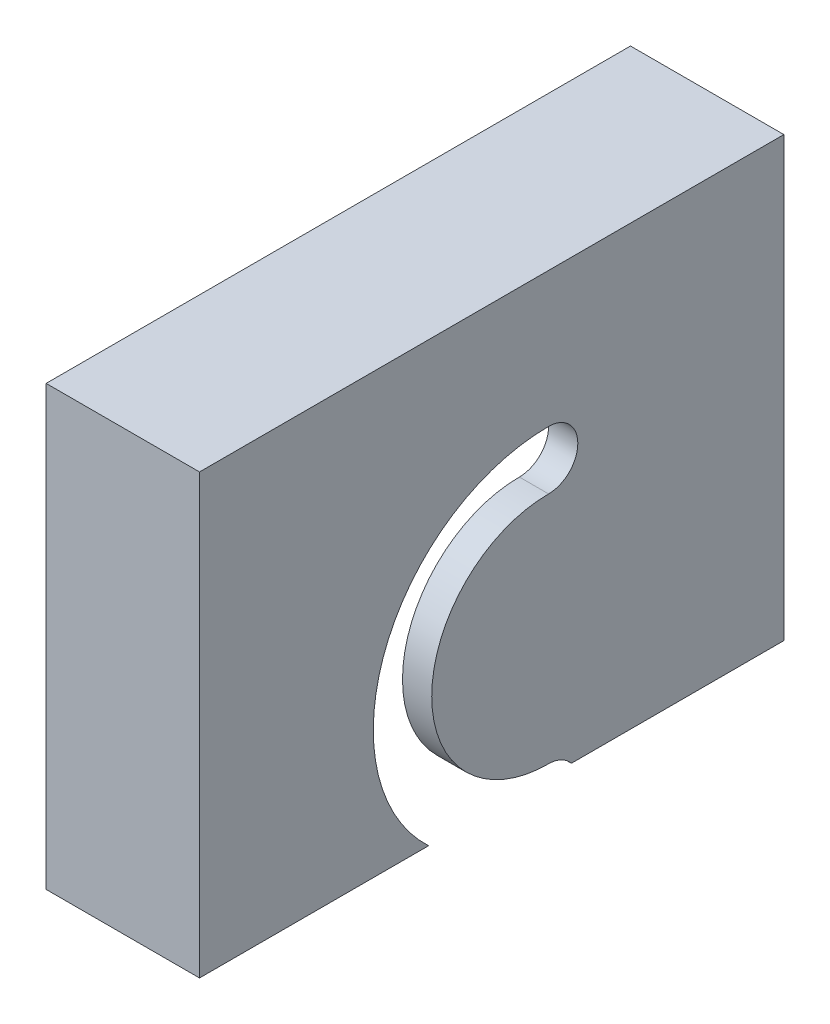
ISO-10303-21;
HEADER;
FILE_DESCRIPTION(('STEP AP214'),'2;1');
FILE_NAME('part.step','',(''),(''),'','','');
FILE_SCHEMA(('AUTOMOTIVE_DESIGN { 1 0 10303 214 1 1 1 1 }'));
ENDSEC;
DATA;
#1=APPLICATION_CONTEXT('core data for automotive mechanical design processes');
#2=APPLICATION_PROTOCOL_DEFINITION('international standard','automotive_design',2000,#1);
#3=PRODUCT_CONTEXT('',#1,'mechanical');
#4=PRODUCT('Part','Part','',(#3));
#5=PRODUCT_RELATED_PRODUCT_CATEGORY('part','',(#4));
#6=PRODUCT_DEFINITION_FORMATION('','',#4);
#7=PRODUCT_DEFINITION_CONTEXT('part definition',#1,'design');
#8=PRODUCT_DEFINITION('design','',#6,#7);
#9=PRODUCT_DEFINITION_SHAPE('','',#8);
#10=(LENGTH_UNIT() NAMED_UNIT(*) SI_UNIT(.MILLI.,.METRE.));
#11=(NAMED_UNIT(*) PLANE_ANGLE_UNIT() SI_UNIT($,.RADIAN.));
#12=(NAMED_UNIT(*) SI_UNIT($,.STERADIAN.) SOLID_ANGLE_UNIT());
#13=UNCERTAINTY_MEASURE_WITH_UNIT(LENGTH_MEASURE(1.E-05),#10,'distance_accuracy_value','');
#14=(GEOMETRIC_REPRESENTATION_CONTEXT(3) GLOBAL_UNCERTAINTY_ASSIGNED_CONTEXT((#13)) GLOBAL_UNIT_ASSIGNED_CONTEXT((#10,
#11,#12)) REPRESENTATION_CONTEXT('',''));
#15=CARTESIAN_POINT('',(0.,0.,0.));
#16=DIRECTION('',(0.,0.,1.));
#17=DIRECTION('',(1.,0.,0.));
#18=AXIS2_PLACEMENT_3D('',#15,#16,#17);
#19=CARTESIAN_POINT('',(21.,-30.,40.));
#20=DIRECTION('',(0.,1.,0.));
#21=DIRECTION('',(0.,0.,1.));
#22=AXIS2_PLACEMENT_3D('',#19,#20,#21);
#23=PLANE('',#22);
#24=DIRECTION('',(1.,0.,0.));
#25=VECTOR('',#24,1.);
#26=CARTESIAN_POINT('',(-55.5697759577992,-30.,-10.9124989991992));
#27=LINE('',#26,#25);
#28=CARTESIAN_POINT('',(21.,-30.,-10.9124989991992));
#29=VERTEX_POINT('',#28);
#30=CARTESIAN_POINT('',(17.,-30.,-10.9124989991992));
#31=VERTEX_POINT('',#30);
#32=EDGE_CURVE('E194',#29,#31,#27,.F.);
#33=ORIENTED_EDGE('',*,*,#32,.T.);
#34=DIRECTION('',(0.,0.,1.));
#35=VECTOR('',#34,1.);
#36=CARTESIAN_POINT('',(17.,-30.,-35.));
#37=LINE('',#36,#35);
#38=CARTESIAN_POINT('',(17.,-30.,-35.));
#39=VERTEX_POINT('',#38);
#40=EDGE_CURVE('E147',#39,#31,#37,.T.);
#41=ORIENTED_EDGE('',*,*,#40,.F.);
#42=DIRECTION('',(-1.,0.,0.));
#43=VECTOR('',#42,1.);
#44=CARTESIAN_POINT('',(110.022469073824,-30.,-35.));
#45=LINE('',#44,#43);
#46=CARTESIAN_POINT('',(0.,-30.,-35.));
#47=VERTEX_POINT('',#46);
#48=EDGE_CURVE('E165',#39,#47,#45,.T.);
#49=ORIENTED_EDGE('',*,*,#48,.T.);
#50=DIRECTION('',(0.,0.,-1.));
#51=VECTOR('',#50,1.);
#52=CARTESIAN_POINT('',(0.,-30.,40.));
#53=LINE('',#52,#51);
#54=CARTESIAN_POINT('',(0.,-30.,-40.));
#55=VERTEX_POINT('',#54);
#56=EDGE_CURVE('E208',#47,#55,#53,.T.);
#57=ORIENTED_EDGE('',*,*,#56,.T.);
#58=DIRECTION('',(-1.,0.,0.));
#59=VECTOR('',#58,1.);
#60=CARTESIAN_POINT('',(21.,-30.,-40.));
#61=LINE('',#60,#59);
#62=CARTESIAN_POINT('',(21.,-30.,-40.));
#63=VERTEX_POINT('',#62);
#64=EDGE_CURVE('E216',#63,#55,#61,.T.);
#65=ORIENTED_EDGE('',*,*,#64,.F.);
#66=DIRECTION('',(0.,0.,-1.));
#67=VECTOR('',#66,1.);
#68=CARTESIAN_POINT('',(21.,-30.,40.));
#69=LINE('',#68,#67);
#70=EDGE_CURVE('E200',#29,#63,#69,.T.);
#71=ORIENTED_EDGE('',*,*,#70,.F.);
#72=EDGE_LOOP('',(#33,#41,#49,#57,#65,#71));
#73=FACE_BOUND('',#72,.T.);
#74=ADVANCED_FACE('F35',(#73),#23,.F.);
#75=CARTESIAN_POINT('',(21.,0.,0.));
#76=DIRECTION('',(1.,0.,0.));
#77=DIRECTION('',(0.,0.,-1.));
#78=AXIS2_PLACEMENT_3D('',#75,#76,#77);
#79=PLANE('',#78);
#80=CARTESIAN_POINT('',(21.,-32.5,-7.79000000000001));
#81=DIRECTION('',(1.,0.,0.));
#82=DIRECTION('',(0.,0.,-1.));
#83=AXIS2_PLACEMENT_3D('',#80,#81,#82);
#84=CIRCLE('',#83,4.);
#85=CARTESIAN_POINT('',(21.,-28.5,-7.79));
#86=VERTEX_POINT('',#85);
#87=EDGE_CURVE('E174',#29,#86,#84,.T.);
#88=ORIENTED_EDGE('',*,*,#87,.F.);
#89=ORIENTED_EDGE('',*,*,#70,.T.);
#90=DIRECTION('',(0.,1.,0.));
#91=VECTOR('',#90,1.);
#92=CARTESIAN_POINT('',(21.,30.,-40.));
#93=LINE('',#92,#91);
#94=CARTESIAN_POINT('',(21.,30.,-40.));
#95=VERTEX_POINT('',#94);
#96=EDGE_CURVE('E202',#63,#95,#93,.T.);
#97=ORIENTED_EDGE('',*,*,#96,.T.);
#98=DIRECTION('',(0.,0.,1.));
#99=VECTOR('',#98,1.);
#100=CARTESIAN_POINT('',(21.,30.,40.));
#101=LINE('',#100,#99);
#102=CARTESIAN_POINT('',(21.,30.,40.));
#103=VERTEX_POINT('',#102);
#104=EDGE_CURVE('E58',#95,#103,#101,.T.);
#105=ORIENTED_EDGE('',*,*,#104,.T.);
#106=DIRECTION('',(0.,-1.,0.));
#107=VECTOR('',#106,1.);
#108=CARTESIAN_POINT('',(21.,30.,40.));
#109=LINE('',#108,#107);
#110=CARTESIAN_POINT('',(21.,-30.,40.));
#111=VERTEX_POINT('',#110);
#112=EDGE_CURVE('E198',#103,#111,#109,.T.);
#113=ORIENTED_EDGE('',*,*,#112,.T.);
#114=CARTESIAN_POINT('',(21.,-30.,8.63406770565684));
#115=VERTEX_POINT('',#114);
#116=EDGE_CURVE('E87',#111,#115,#69,.T.);
#117=ORIENTED_EDGE('',*,*,#116,.T.);
#118=CARTESIAN_POINT('',(21.,-12.5,-7.79000000000001));
#119=DIRECTION('',(1.,0.,0.));
#120=DIRECTION('',(0.,0.,-1.));
#121=AXIS2_PLACEMENT_3D('',#118,#119,#120);
#122=CIRCLE('',#121,24.);
#123=CARTESIAN_POINT('',(21.,11.5,-7.79000000000001));
#124=VERTEX_POINT('',#123);
#125=EDGE_CURVE('E183',#124,#115,#122,.T.);
#126=ORIENTED_EDGE('',*,*,#125,.F.);
#127=CARTESIAN_POINT('',(21.,7.5,-7.79000000000001));
#128=DIRECTION('',(1.,0.,0.));
#129=DIRECTION('',(0.,0.,-1.));
#130=AXIS2_PLACEMENT_3D('',#127,#128,#129);
#131=CIRCLE('',#130,4.);
#132=CARTESIAN_POINT('',(21.,3.5,-7.79000000000001));
#133=VERTEX_POINT('',#132);
#134=EDGE_CURVE('E180',#133,#124,#131,.T.);
#135=ORIENTED_EDGE('',*,*,#134,.F.);
#136=CARTESIAN_POINT('',(21.,-12.5,-7.79000000000001));
#137=DIRECTION('',(-1.,0.,0.));
#138=DIRECTION('',(0.,0.,-1.));
#139=AXIS2_PLACEMENT_3D('',#136,#137,#138);
#140=CIRCLE('',#139,16.);
#141=EDGE_CURVE('E177',#86,#133,#140,.T.);
#142=ORIENTED_EDGE('',*,*,#141,.F.);
#143=EDGE_LOOP('',(#88,#89,#97,#105,#113,#117,#126,#135,#142));
#144=FACE_BOUND('',#143,.T.);
#145=ADVANCED_FACE('F253',(#144),#79,.T.);
#146=CARTESIAN_POINT('',(0.,0.,0.));
#147=DIRECTION('',(1.,0.,0.));
#148=DIRECTION('',(0.,0.,-1.));
#149=AXIS2_PLACEMENT_3D('',#146,#147,#148);
#150=PLANE('',#149);
#151=DIRECTION('',(0.,0.,-1.));
#152=VECTOR('',#151,1.);
#153=CARTESIAN_POINT('',(0.,25.,-35.));
#154=LINE('',#153,#152);
#155=CARTESIAN_POINT('',(0.,25.,35.));
#156=VERTEX_POINT('',#155);
#157=CARTESIAN_POINT('',(0.,25.,-35.));
#158=VERTEX_POINT('',#157);
#159=EDGE_CURVE('E148',#156,#158,#154,.T.);
#160=ORIENTED_EDGE('',*,*,#159,.F.);
#161=DIRECTION('',(0.,1.,0.));
#162=VECTOR('',#161,1.);
#163=CARTESIAN_POINT('',(0.,-30.,35.));
#164=LINE('',#163,#162);
#165=CARTESIAN_POINT('',(0.,-30.,35.));
#166=VERTEX_POINT('',#165);
#167=EDGE_CURVE('E226',#166,#156,#164,.T.);
#168=ORIENTED_EDGE('',*,*,#167,.F.);
#169=CARTESIAN_POINT('',(0.,-30.,40.));
#170=VERTEX_POINT('',#169);
#171=EDGE_CURVE('E160',#170,#166,#53,.T.);
#172=ORIENTED_EDGE('',*,*,#171,.F.);
#173=DIRECTION('',(0.,-1.,0.));
#174=VECTOR('',#173,1.);
#175=CARTESIAN_POINT('',(0.,30.,40.));
#176=LINE('',#175,#174);
#177=CARTESIAN_POINT('',(0.,30.,40.));
#178=VERTEX_POINT('',#177);
#179=EDGE_CURVE('E197',#178,#170,#176,.T.);
#180=ORIENTED_EDGE('',*,*,#179,.F.);
#181=DIRECTION('',(0.,0.,1.));
#182=VECTOR('',#181,1.);
#183=CARTESIAN_POINT('',(0.,30.,40.));
#184=LINE('',#183,#182);
#185=CARTESIAN_POINT('',(0.,30.,-40.));
#186=VERTEX_POINT('',#185);
#187=EDGE_CURVE('E79',#186,#178,#184,.T.);
#188=ORIENTED_EDGE('',*,*,#187,.F.);
#189=DIRECTION('',(0.,1.,0.));
#190=VECTOR('',#189,1.);
#191=CARTESIAN_POINT('',(0.,30.,-40.));
#192=LINE('',#191,#190);
#193=EDGE_CURVE('E210',#55,#186,#192,.T.);
#194=ORIENTED_EDGE('',*,*,#193,.F.);
#195=ORIENTED_EDGE('',*,*,#56,.F.);
#196=DIRECTION('',(0.,-1.,0.));
#197=VECTOR('',#196,1.);
#198=CARTESIAN_POINT('',(0.,-30.,-35.));
#199=LINE('',#198,#197);
#200=EDGE_CURVE('E229',#158,#47,#199,.T.);
#201=ORIENTED_EDGE('',*,*,#200,.F.);
#202=EDGE_LOOP('',(#160,#168,#172,#180,#188,#194,#195,#201));
#203=FACE_BOUND('',#202,.T.);
#204=ADVANCED_FACE('F224',(#203),#150,.F.);
#205=CARTESIAN_POINT('',(21.,30.,40.));
#206=DIRECTION('',(0.,0.,-1.));
#207=DIRECTION('',(-1.,0.,0.));
#208=AXIS2_PLACEMENT_3D('',#205,#206,#207);
#209=PLANE('',#208);
#210=ORIENTED_EDGE('',*,*,#179,.T.);
#211=DIRECTION('',(-1.,0.,0.));
#212=VECTOR('',#211,1.);
#213=CARTESIAN_POINT('',(21.,-30.,40.));
#214=LINE('',#213,#212);
#215=EDGE_CURVE('E43',#111,#170,#214,.T.);
#216=ORIENTED_EDGE('',*,*,#215,.F.);
#217=ORIENTED_EDGE('',*,*,#112,.F.);
#218=DIRECTION('',(-1.,0.,0.));
#219=VECTOR('',#218,1.);
#220=CARTESIAN_POINT('',(21.,30.,40.));
#221=LINE('',#220,#219);
#222=EDGE_CURVE('E205',#103,#178,#221,.T.);
#223=ORIENTED_EDGE('',*,*,#222,.T.);
#224=EDGE_LOOP('',(#210,#216,#217,#223));
#225=FACE_BOUND('',#224,.T.);
#226=ADVANCED_FACE('F37',(#225),#209,.F.);
#227=DIRECTION('',(-1.,0.,0.));
#228=VECTOR('',#227,1.);
#229=CARTESIAN_POINT('',(110.022469073824,-30.,35.));
#230=LINE('',#229,#228);
#231=CARTESIAN_POINT('',(17.,-30.,35.));
#232=VERTEX_POINT('',#231);
#233=EDGE_CURVE('E154',#232,#166,#230,.T.);
#234=ORIENTED_EDGE('',*,*,#233,.F.);
#235=CARTESIAN_POINT('',(17.,-30.,8.63406770565684));
#236=VERTEX_POINT('',#235);
#237=EDGE_CURVE('E138',#236,#232,#37,.T.);
#238=ORIENTED_EDGE('',*,*,#237,.F.);
#239=DIRECTION('',(1.,0.,0.));
#240=VECTOR('',#239,1.);
#241=CARTESIAN_POINT('',(-55.5697759577992,-30.,8.63406770565684));
#242=LINE('',#241,#240);
#243=EDGE_CURVE('E189',#236,#115,#242,.T.);
#244=ORIENTED_EDGE('',*,*,#243,.T.);
#245=ORIENTED_EDGE('',*,*,#116,.F.);
#246=ORIENTED_EDGE('',*,*,#215,.T.);
#247=ORIENTED_EDGE('',*,*,#171,.T.);
#248=EDGE_LOOP('',(#234,#238,#244,#245,#246,#247));
#249=FACE_BOUND('',#248,.T.);
#250=ADVANCED_FACE('F159',(#249),#23,.F.);
#251=CARTESIAN_POINT('',(21.,30.,-40.));
#252=DIRECTION('',(0.,0.,1.));
#253=DIRECTION('',(0.,-1.,0.));
#254=AXIS2_PLACEMENT_3D('',#251,#252,#253);
#255=PLANE('',#254);
#256=ORIENTED_EDGE('',*,*,#193,.T.);
#257=DIRECTION('',(-1.,0.,0.));
#258=VECTOR('',#257,1.);
#259=CARTESIAN_POINT('',(21.,30.,-40.));
#260=LINE('',#259,#258);
#261=EDGE_CURVE('E214',#95,#186,#260,.T.);
#262=ORIENTED_EDGE('',*,*,#261,.F.);
#263=ORIENTED_EDGE('',*,*,#96,.F.);
#264=ORIENTED_EDGE('',*,*,#64,.T.);
#265=EDGE_LOOP('',(#256,#262,#263,#264));
#266=FACE_BOUND('',#265,.T.);
#267=ADVANCED_FACE('F250',(#266),#255,.F.);
#268=CARTESIAN_POINT('',(21.,30.,40.));
#269=DIRECTION('',(0.,-1.,0.));
#270=DIRECTION('',(0.,0.,-1.));
#271=AXIS2_PLACEMENT_3D('',#268,#269,#270);
#272=PLANE('',#271);
#273=ORIENTED_EDGE('',*,*,#187,.T.);
#274=ORIENTED_EDGE('',*,*,#222,.F.);
#275=ORIENTED_EDGE('',*,*,#104,.F.);
#276=ORIENTED_EDGE('',*,*,#261,.T.);
#277=EDGE_LOOP('',(#273,#274,#275,#276));
#278=FACE_BOUND('',#277,.T.);
#279=ADVANCED_FACE('F275',(#278),#272,.F.);
#280=CARTESIAN_POINT('',(-55.5697759577992,-32.5,-7.79000000000001));
#281=DIRECTION('',(1.,0.,0.));
#282=DIRECTION('',(0.,0.,-1.));
#283=AXIS2_PLACEMENT_3D('',#280,#281,#282);
#284=CYLINDRICAL_SURFACE('',#283,4.);
#285=DIRECTION('',(1.,0.,0.));
#286=VECTOR('',#285,1.);
#287=CARTESIAN_POINT('',(-55.5697759577992,-28.5,-7.79));
#288=LINE('',#287,#286);
#289=CARTESIAN_POINT('',(17.,-28.5,-7.79));
#290=VERTEX_POINT('',#289);
#291=EDGE_CURVE('E186',#290,#86,#288,.T.);
#292=ORIENTED_EDGE('',*,*,#291,.F.);
#293=CARTESIAN_POINT('',(17.,-32.5,-7.79000000000001));
#294=DIRECTION('',(1.,0.,0.));
#295=DIRECTION('',(0.,0.,-1.));
#296=AXIS2_PLACEMENT_3D('',#293,#294,#295);
#297=CIRCLE('',#296,4.);
#298=EDGE_CURVE('E50',#290,#31,#297,.F.);
#299=ORIENTED_EDGE('',*,*,#298,.T.);
#300=ORIENTED_EDGE('',*,*,#32,.F.);
#301=ORIENTED_EDGE('',*,*,#87,.T.);
#302=EDGE_LOOP('',(#292,#299,#300,#301));
#303=FACE_BOUND('',#302,.T.);
#304=ADVANCED_FACE('F257',(#303),#284,.F.);
#305=CARTESIAN_POINT('',(-55.5697759577992,-12.5,-7.79000000000001));
#306=DIRECTION('',(1.,0.,0.));
#307=DIRECTION('',(0.,0.,-1.));
#308=AXIS2_PLACEMENT_3D('',#305,#306,#307);
#309=CYLINDRICAL_SURFACE('',#308,24.);
#310=ORIENTED_EDGE('',*,*,#243,.F.);
#311=CARTESIAN_POINT('',(17.,-12.5,-7.79000000000001));
#312=DIRECTION('',(1.,0.,0.));
#313=DIRECTION('',(0.,0.,-1.));
#314=AXIS2_PLACEMENT_3D('',#311,#312,#313);
#315=CIRCLE('',#314,24.);
#316=CARTESIAN_POINT('',(17.,11.5,-7.79000000000001));
#317=VERTEX_POINT('',#316);
#318=EDGE_CURVE('E144',#236,#317,#315,.F.);
#319=ORIENTED_EDGE('',*,*,#318,.T.);
#320=DIRECTION('',(1.,0.,0.));
#321=VECTOR('',#320,1.);
#322=CARTESIAN_POINT('',(-55.5697759577992,11.5,-7.79000000000001));
#323=LINE('',#322,#321);
#324=EDGE_CURVE('E187',#317,#124,#323,.T.);
#325=ORIENTED_EDGE('',*,*,#324,.T.);
#326=ORIENTED_EDGE('',*,*,#125,.T.);
#327=EDGE_LOOP('',(#310,#319,#325,#326));
#328=FACE_BOUND('',#327,.T.);
#329=ADVANCED_FACE('F267',(#328),#309,.F.);
#330=CARTESIAN_POINT('',(-55.5697759577992,7.5,-7.79000000000001));
#331=DIRECTION('',(1.,0.,0.));
#332=DIRECTION('',(0.,0.,-1.));
#333=AXIS2_PLACEMENT_3D('',#330,#331,#332);
#334=CYLINDRICAL_SURFACE('',#333,4.);
#335=ORIENTED_EDGE('',*,*,#324,.F.);
#336=CARTESIAN_POINT('',(17.,7.5,-7.79000000000001));
#337=DIRECTION('',(1.,0.,0.));
#338=DIRECTION('',(0.,0.,-1.));
#339=AXIS2_PLACEMENT_3D('',#336,#337,#338);
#340=CIRCLE('',#339,4.);
#341=CARTESIAN_POINT('',(17.,3.5,-7.79000000000001));
#342=VERTEX_POINT('',#341);
#343=EDGE_CURVE('E168',#317,#342,#340,.F.);
#344=ORIENTED_EDGE('',*,*,#343,.T.);
#345=DIRECTION('',(1.,0.,0.));
#346=VECTOR('',#345,1.);
#347=CARTESIAN_POINT('',(-55.5697759577992,3.5,-7.79000000000001));
#348=LINE('',#347,#346);
#349=EDGE_CURVE('E190',#342,#133,#348,.T.);
#350=ORIENTED_EDGE('',*,*,#349,.T.);
#351=ORIENTED_EDGE('',*,*,#134,.T.);
#352=EDGE_LOOP('',(#335,#344,#350,#351));
#353=FACE_BOUND('',#352,.T.);
#354=ADVANCED_FACE('F264',(#353),#334,.F.);
#355=CARTESIAN_POINT('',(-55.5697759577992,-12.5,-7.79000000000001));
#356=DIRECTION('',(1.,0.,0.));
#357=DIRECTION('',(0.,0.,-1.));
#358=AXIS2_PLACEMENT_3D('',#355,#356,#357);
#359=CYLINDRICAL_SURFACE('',#358,16.);
#360=ORIENTED_EDGE('',*,*,#349,.F.);
#361=CARTESIAN_POINT('',(17.,-12.5,-7.79000000000001));
#362=DIRECTION('',(1.,0.,0.));
#363=DIRECTION('',(0.,0.,-1.));
#364=AXIS2_PLACEMENT_3D('',#361,#362,#363);
#365=CIRCLE('',#364,16.);
#366=EDGE_CURVE('E12',#342,#290,#365,.T.);
#367=ORIENTED_EDGE('',*,*,#366,.T.);
#368=ORIENTED_EDGE('',*,*,#291,.T.);
#369=ORIENTED_EDGE('',*,*,#141,.T.);
#370=EDGE_LOOP('',(#360,#367,#368,#369));
#371=FACE_BOUND('',#370,.T.);
#372=ADVANCED_FACE('F260',(#371),#359,.T.);
#373=CARTESIAN_POINT('',(17.,0.,0.));
#374=DIRECTION('',(1.,0.,0.));
#375=DIRECTION('',(0.,0.,-1.));
#376=AXIS2_PLACEMENT_3D('',#373,#374,#375);
#377=PLANE('',#376);
#378=ORIENTED_EDGE('',*,*,#366,.F.);
#379=ORIENTED_EDGE('',*,*,#343,.F.);
#380=ORIENTED_EDGE('',*,*,#318,.F.);
#381=ORIENTED_EDGE('',*,*,#237,.T.);
#382=DIRECTION('',(0.,1.,0.));
#383=VECTOR('',#382,1.);
#384=CARTESIAN_POINT('',(17.,-30.,35.));
#385=LINE('',#384,#383);
#386=CARTESIAN_POINT('',(17.,25.,35.));
#387=VERTEX_POINT('',#386);
#388=EDGE_CURVE('E142',#232,#387,#385,.T.);
#389=ORIENTED_EDGE('',*,*,#388,.T.);
#390=DIRECTION('',(0.,0.,-1.));
#391=VECTOR('',#390,1.);
#392=CARTESIAN_POINT('',(17.,25.,-35.));
#393=LINE('',#392,#391);
#394=CARTESIAN_POINT('',(17.,25.,-35.));
#395=VERTEX_POINT('',#394);
#396=EDGE_CURVE('E236',#387,#395,#393,.T.);
#397=ORIENTED_EDGE('',*,*,#396,.T.);
#398=DIRECTION('',(0.,-1.,0.));
#399=VECTOR('',#398,1.);
#400=CARTESIAN_POINT('',(17.,-30.,-35.));
#401=LINE('',#400,#399);
#402=EDGE_CURVE('E169',#395,#39,#401,.T.);
#403=ORIENTED_EDGE('',*,*,#402,.T.);
#404=ORIENTED_EDGE('',*,*,#40,.T.);
#405=ORIENTED_EDGE('',*,*,#298,.F.);
#406=EDGE_LOOP('',(#378,#379,#380,#381,#389,#397,#403,#404,#405));
#407=FACE_BOUND('',#406,.T.);
#408=ADVANCED_FACE('F140',(#407),#377,.F.);
#409=CARTESIAN_POINT('',(110.022469073824,-30.,35.));
#410=DIRECTION('',(0.,0.,1.));
#411=DIRECTION('',(1.,0.,0.));
#412=AXIS2_PLACEMENT_3D('',#409,#410,#411);
#413=PLANE('',#412);
#414=ORIENTED_EDGE('',*,*,#233,.T.);
#415=ORIENTED_EDGE('',*,*,#167,.T.);
#416=DIRECTION('',(-1.,0.,0.));
#417=VECTOR('',#416,1.);
#418=CARTESIAN_POINT('',(110.022469073824,25.,35.));
#419=LINE('',#418,#417);
#420=EDGE_CURVE('E156',#387,#156,#419,.T.);
#421=ORIENTED_EDGE('',*,*,#420,.F.);
#422=ORIENTED_EDGE('',*,*,#388,.F.);
#423=EDGE_LOOP('',(#414,#415,#421,#422));
#424=FACE_BOUND('',#423,.T.);
#425=ADVANCED_FACE('F152',(#424),#413,.F.);
#426=CARTESIAN_POINT('',(110.022469073824,25.,-35.));
#427=DIRECTION('',(0.,1.,0.));
#428=DIRECTION('',(0.,0.,1.));
#429=AXIS2_PLACEMENT_3D('',#426,#427,#428);
#430=PLANE('',#429);
#431=ORIENTED_EDGE('',*,*,#420,.T.);
#432=ORIENTED_EDGE('',*,*,#159,.T.);
#433=DIRECTION('',(-1.,0.,0.));
#434=VECTOR('',#433,1.);
#435=CARTESIAN_POINT('',(110.022469073824,25.,-35.));
#436=LINE('',#435,#434);
#437=EDGE_CURVE('E235',#395,#158,#436,.T.);
#438=ORIENTED_EDGE('',*,*,#437,.F.);
#439=ORIENTED_EDGE('',*,*,#396,.F.);
#440=EDGE_LOOP('',(#431,#432,#438,#439));
#441=FACE_BOUND('',#440,.T.);
#442=ADVANCED_FACE('F242',(#441),#430,.F.);
#443=CARTESIAN_POINT('',(110.022469073824,-30.,-35.));
#444=DIRECTION('',(0.,0.,-1.));
#445=DIRECTION('',(-1.,0.,0.));
#446=AXIS2_PLACEMENT_3D('',#443,#444,#445);
#447=PLANE('',#446);
#448=ORIENTED_EDGE('',*,*,#437,.T.);
#449=ORIENTED_EDGE('',*,*,#200,.T.);
#450=ORIENTED_EDGE('',*,*,#48,.F.);
#451=ORIENTED_EDGE('',*,*,#402,.F.);
#452=EDGE_LOOP('',(#448,#449,#450,#451));
#453=FACE_BOUND('',#452,.T.);
#454=ADVANCED_FACE('F239',(#453),#447,.F.);
#455=CLOSED_SHELL('',(#74,#145,#204,#226,#250,#267,#279,#304,#329,#354,#372,#408,#425,#442,#454));
#456=MANIFOLD_SOLID_BREP('B2',#455);
#457=ADVANCED_BREP_SHAPE_REPRESENTATION('',(#18,#456),#14);
#458=SHAPE_DEFINITION_REPRESENTATION(#9,#457);
ENDSEC;
END-ISO-10303-21;
